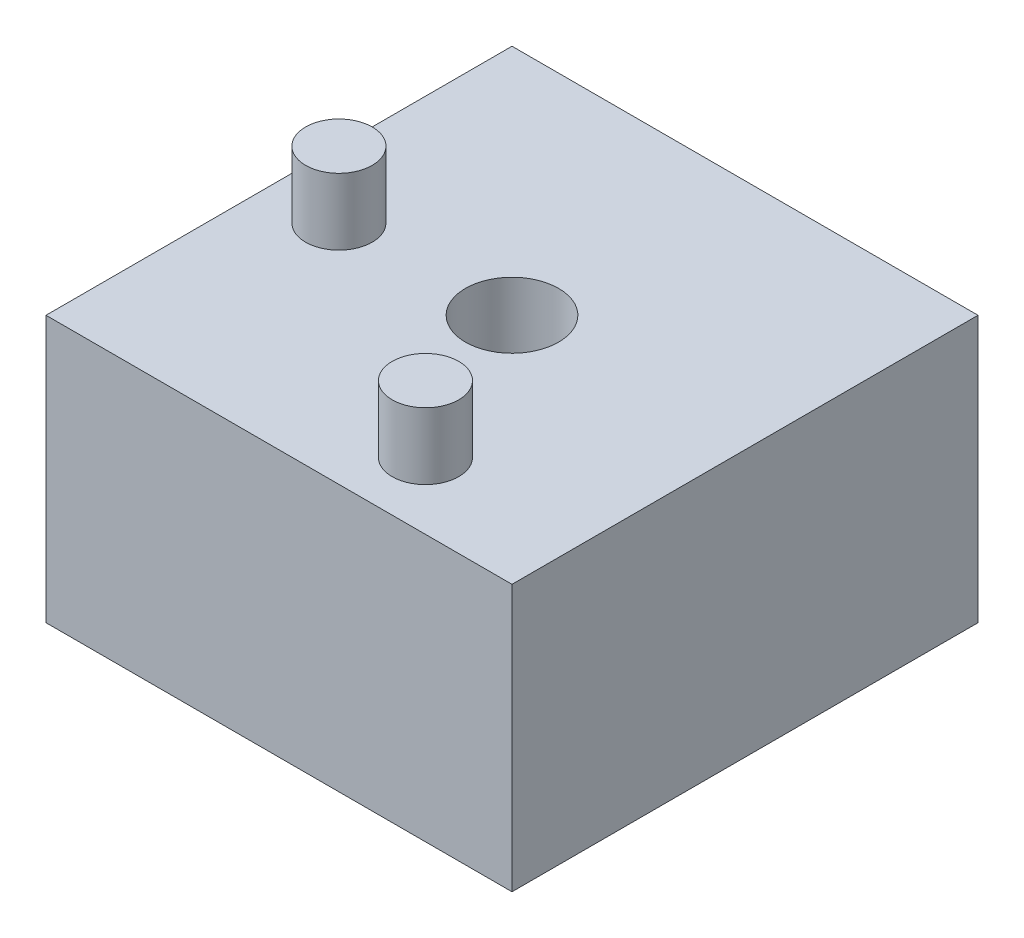
ISO-10303-21;
HEADER;
FILE_DESCRIPTION(('STEP AP214'),'2;1');
FILE_NAME('part.step','',(''),(''),'','','');
FILE_SCHEMA(('AUTOMOTIVE_DESIGN { 1 0 10303 214 1 1 1 1 }'));
ENDSEC;
DATA;
#1=APPLICATION_CONTEXT('core data for automotive mechanical design processes');
#2=APPLICATION_PROTOCOL_DEFINITION('international standard','automotive_design',2000,#1);
#3=PRODUCT_CONTEXT('',#1,'mechanical');
#4=PRODUCT('Part','Part','',(#3));
#5=PRODUCT_RELATED_PRODUCT_CATEGORY('part','',(#4));
#6=PRODUCT_DEFINITION_FORMATION('','',#4);
#7=PRODUCT_DEFINITION_CONTEXT('part definition',#1,'design');
#8=PRODUCT_DEFINITION('design','',#6,#7);
#9=PRODUCT_DEFINITION_SHAPE('','',#8);
#10=(LENGTH_UNIT() NAMED_UNIT(*) SI_UNIT(.MILLI.,.METRE.));
#11=(NAMED_UNIT(*) PLANE_ANGLE_UNIT() SI_UNIT($,.RADIAN.));
#12=(NAMED_UNIT(*) SI_UNIT($,.STERADIAN.) SOLID_ANGLE_UNIT());
#13=UNCERTAINTY_MEASURE_WITH_UNIT(LENGTH_MEASURE(1.E-05),#10,'distance_accuracy_value','');
#14=(GEOMETRIC_REPRESENTATION_CONTEXT(3) GLOBAL_UNCERTAINTY_ASSIGNED_CONTEXT((#13)) GLOBAL_UNIT_ASSIGNED_CONTEXT((#10,
#11,#12)) REPRESENTATION_CONTEXT('',''));
#15=CARTESIAN_POINT('',(0.,0.,0.));
#16=DIRECTION('',(0.,0.,1.));
#17=DIRECTION('',(1.,0.,0.));
#18=AXIS2_PLACEMENT_3D('',#15,#16,#17);
#19=CARTESIAN_POINT('',(0.,25.4,0.));
#20=DIRECTION('',(1.,0.,0.));
#21=DIRECTION('',(0.,0.,-1.));
#22=AXIS2_PLACEMENT_3D('',#19,#20,#21);
#23=PLANE('',#22);
#24=DIRECTION('',(0.,0.,1.));
#25=VECTOR('',#24,1.);
#26=CARTESIAN_POINT('',(0.,0.,0.));
#27=LINE('',#26,#25);
#28=CARTESIAN_POINT('',(0.,0.,-44.45));
#29=VERTEX_POINT('',#28);
#30=CARTESIAN_POINT('',(0.,0.,0.));
#31=VERTEX_POINT('',#30);
#32=EDGE_CURVE('E120',#29,#31,#27,.T.);
#33=ORIENTED_EDGE('',*,*,#32,.T.);
#34=DIRECTION('',(0.,-1.,0.));
#35=VECTOR('',#34,1.);
#36=CARTESIAN_POINT('',(0.,25.4,0.));
#37=LINE('',#36,#35);
#38=CARTESIAN_POINT('',(0.,25.4,0.));
#39=VERTEX_POINT('',#38);
#40=EDGE_CURVE('E48',#39,#31,#37,.T.);
#41=ORIENTED_EDGE('',*,*,#40,.F.);
#42=DIRECTION('',(0.,0.,1.));
#43=VECTOR('',#42,1.);
#44=CARTESIAN_POINT('',(0.,25.4,0.));
#45=LINE('',#44,#43);
#46=CARTESIAN_POINT('',(0.,25.4,-44.45));
#47=VERTEX_POINT('',#46);
#48=EDGE_CURVE('E99',#47,#39,#45,.T.);
#49=ORIENTED_EDGE('',*,*,#48,.F.);
#50=DIRECTION('',(0.,-1.,0.));
#51=VECTOR('',#50,1.);
#52=CARTESIAN_POINT('',(0.,25.4,-44.45));
#53=LINE('',#52,#51);
#54=EDGE_CURVE('E113',#47,#29,#53,.T.);
#55=ORIENTED_EDGE('',*,*,#54,.T.);
#56=EDGE_LOOP('',(#33,#41,#49,#55));
#57=FACE_BOUND('',#56,.T.);
#58=ADVANCED_FACE('F44',(#57),#23,.F.);
#59=CARTESIAN_POINT('',(0.,25.4,0.));
#60=DIRECTION('',(0.,0.,-1.));
#61=DIRECTION('',(-1.,0.,0.));
#62=AXIS2_PLACEMENT_3D('',#59,#60,#61);
#63=PLANE('',#62);
#64=DIRECTION('',(1.,0.,0.));
#65=VECTOR('',#64,1.);
#66=CARTESIAN_POINT('',(0.,0.,0.));
#67=LINE('',#66,#65);
#68=CARTESIAN_POINT('',(44.45,0.,0.));
#69=VERTEX_POINT('',#68);
#70=EDGE_CURVE('E106',#31,#69,#67,.T.);
#71=ORIENTED_EDGE('',*,*,#70,.T.);
#72=DIRECTION('',(0.,-1.,0.));
#73=VECTOR('',#72,1.);
#74=CARTESIAN_POINT('',(44.45,25.4,0.));
#75=LINE('',#74,#73);
#76=CARTESIAN_POINT('',(44.45,25.4,0.));
#77=VERTEX_POINT('',#76);
#78=EDGE_CURVE('E104',#77,#69,#75,.T.);
#79=ORIENTED_EDGE('',*,*,#78,.F.);
#80=DIRECTION('',(1.,0.,0.));
#81=VECTOR('',#80,1.);
#82=CARTESIAN_POINT('',(0.,25.4,0.));
#83=LINE('',#82,#81);
#84=EDGE_CURVE('E93',#39,#77,#83,.T.);
#85=ORIENTED_EDGE('',*,*,#84,.F.);
#86=ORIENTED_EDGE('',*,*,#40,.T.);
#87=EDGE_LOOP('',(#71,#79,#85,#86));
#88=FACE_BOUND('',#87,.T.);
#89=ADVANCED_FACE('F102',(#88),#63,.F.);
#90=CARTESIAN_POINT('',(44.45,25.4,0.));
#91=DIRECTION('',(-1.,0.,0.));
#92=DIRECTION('',(0.,0.,1.));
#93=AXIS2_PLACEMENT_3D('',#90,#91,#92);
#94=PLANE('',#93);
#95=DIRECTION('',(0.,0.,-1.));
#96=VECTOR('',#95,1.);
#97=CARTESIAN_POINT('',(44.45,0.,0.));
#98=LINE('',#97,#96);
#99=CARTESIAN_POINT('',(44.45,0.,-44.45));
#100=VERTEX_POINT('',#99);
#101=EDGE_CURVE('E82',#69,#100,#98,.T.);
#102=ORIENTED_EDGE('',*,*,#101,.T.);
#103=DIRECTION('',(0.,-1.,0.));
#104=VECTOR('',#103,1.);
#105=CARTESIAN_POINT('',(44.45,25.4,-44.45));
#106=LINE('',#105,#104);
#107=CARTESIAN_POINT('',(44.45,25.4,-44.45));
#108=VERTEX_POINT('',#107);
#109=EDGE_CURVE('E108',#108,#100,#106,.T.);
#110=ORIENTED_EDGE('',*,*,#109,.F.);
#111=DIRECTION('',(0.,0.,-1.));
#112=VECTOR('',#111,1.);
#113=CARTESIAN_POINT('',(44.45,25.4,0.));
#114=LINE('',#113,#112);
#115=EDGE_CURVE('E96',#77,#108,#114,.T.);
#116=ORIENTED_EDGE('',*,*,#115,.F.);
#117=ORIENTED_EDGE('',*,*,#78,.T.);
#118=EDGE_LOOP('',(#102,#110,#116,#117));
#119=FACE_BOUND('',#118,.T.);
#120=ADVANCED_FACE('F107',(#119),#94,.F.);
#121=CARTESIAN_POINT('',(0.,25.4,-44.45));
#122=DIRECTION('',(0.,0.,1.));
#123=DIRECTION('',(1.,0.,0.));
#124=AXIS2_PLACEMENT_3D('',#121,#122,#123);
#125=PLANE('',#124);
#126=DIRECTION('',(-1.,0.,0.));
#127=VECTOR('',#126,1.);
#128=CARTESIAN_POINT('',(0.,0.,-44.45));
#129=LINE('',#128,#127);
#130=EDGE_CURVE('E90',#100,#29,#129,.T.);
#131=ORIENTED_EDGE('',*,*,#130,.T.);
#132=ORIENTED_EDGE('',*,*,#54,.F.);
#133=DIRECTION('',(-1.,0.,0.));
#134=VECTOR('',#133,1.);
#135=CARTESIAN_POINT('',(0.,25.4,-44.45));
#136=LINE('',#135,#134);
#137=EDGE_CURVE('E61',#108,#47,#136,.T.);
#138=ORIENTED_EDGE('',*,*,#137,.F.);
#139=ORIENTED_EDGE('',*,*,#109,.T.);
#140=EDGE_LOOP('',(#131,#132,#138,#139));
#141=FACE_BOUND('',#140,.T.);
#142=ADVANCED_FACE('F131',(#141),#125,.F.);
#143=CARTESIAN_POINT('',(0.,25.4,0.));
#144=DIRECTION('',(0.,-1.,0.));
#145=DIRECTION('',(0.,0.,-1.));
#146=AXIS2_PLACEMENT_3D('',#143,#144,#145);
#147=PLANE('',#146);
#148=CARTESIAN_POINT('',(22.225,25.4,-22.225));
#149=DIRECTION('',(0.,-1.,0.));
#150=DIRECTION('',(0.,0.,-1.));
#151=AXIS2_PLACEMENT_3D('',#148,#149,#150);
#152=CIRCLE('',#151,4.445);
#153=CARTESIAN_POINT('',(22.225,25.4,-26.67));
#154=VERTEX_POINT('',#153);
#155=EDGE_CURVE('E145',#154,#154,#152,.T.);
#156=ORIENTED_EDGE('',*,*,#155,.T.);
#157=EDGE_LOOP('',(#156));
#158=FACE_BOUND('',#157,.T.);
#159=CARTESIAN_POINT('',(6.34999999999999,25.4,-21.59));
#160=DIRECTION('',(0.,1.,0.));
#161=DIRECTION('',(0.,0.,1.));
#162=AXIS2_PLACEMENT_3D('',#159,#160,#161);
#163=CIRCLE('',#162,3.175);
#164=CARTESIAN_POINT('',(6.34999999999999,25.4,-18.415));
#165=VERTEX_POINT('',#164);
#166=EDGE_CURVE('E11',#165,#165,#163,.T.);
#167=ORIENTED_EDGE('',*,*,#166,.F.);
#168=EDGE_LOOP('',(#167));
#169=FACE_BOUND('',#168,.T.);
#170=CARTESIAN_POINT('',(29.845,25.4,-6.35));
#171=DIRECTION('',(0.,1.,0.));
#172=DIRECTION('',(0.,0.,1.));
#173=AXIS2_PLACEMENT_3D('',#170,#171,#172);
#174=CIRCLE('',#173,3.175);
#175=CARTESIAN_POINT('',(29.845,25.4,-3.175));
#176=VERTEX_POINT('',#175);
#177=EDGE_CURVE('E54',#176,#176,#174,.T.);
#178=ORIENTED_EDGE('',*,*,#177,.F.);
#179=EDGE_LOOP('',(#178));
#180=FACE_BOUND('',#179,.T.);
#181=ORIENTED_EDGE('',*,*,#48,.T.);
#182=ORIENTED_EDGE('',*,*,#84,.T.);
#183=ORIENTED_EDGE('',*,*,#115,.T.);
#184=ORIENTED_EDGE('',*,*,#137,.T.);
#185=EDGE_LOOP('',(#181,#182,#183,#184));
#186=FACE_BOUND('',#185,.T.);
#187=ADVANCED_FACE('F98',(#158,#169,#180,#186),#147,.F.);
#188=CARTESIAN_POINT('',(0.,0.,0.));
#189=DIRECTION('',(0.,-1.,0.));
#190=DIRECTION('',(0.,0.,-1.));
#191=AXIS2_PLACEMENT_3D('',#188,#189,#190);
#192=PLANE('',#191);
#193=CARTESIAN_POINT('',(22.225,0.,-22.225));
#194=DIRECTION('',(0.,-1.,0.));
#195=DIRECTION('',(0.,0.,-1.));
#196=AXIS2_PLACEMENT_3D('',#193,#194,#195);
#197=CIRCLE('',#196,4.445);
#198=CARTESIAN_POINT('',(22.225,0.,-26.67));
#199=VERTEX_POINT('',#198);
#200=EDGE_CURVE('E146',#199,#199,#197,.T.);
#201=ORIENTED_EDGE('',*,*,#200,.F.);
#202=EDGE_LOOP('',(#201));
#203=FACE_BOUND('',#202,.T.);
#204=ORIENTED_EDGE('',*,*,#32,.F.);
#205=ORIENTED_EDGE('',*,*,#130,.F.);
#206=ORIENTED_EDGE('',*,*,#101,.F.);
#207=ORIENTED_EDGE('',*,*,#70,.F.);
#208=EDGE_LOOP('',(#204,#205,#206,#207));
#209=FACE_BOUND('',#208,.T.);
#210=ADVANCED_FACE('F132',(#203,#209),#192,.T.);
#211=CARTESIAN_POINT('',(29.845,31.75,-6.35));
#212=DIRECTION('',(0.,-1.,0.));
#213=DIRECTION('',(0.,0.,-1.));
#214=AXIS2_PLACEMENT_3D('',#211,#212,#213);
#215=CYLINDRICAL_SURFACE('',#214,3.175);
#216=CARTESIAN_POINT('',(29.845,31.75,-6.35));
#217=DIRECTION('',(0.,1.,0.));
#218=DIRECTION('',(0.,0.,1.));
#219=AXIS2_PLACEMENT_3D('',#216,#217,#218);
#220=CIRCLE('',#219,3.175);
#221=CARTESIAN_POINT('',(29.845,31.75,-3.175));
#222=VERTEX_POINT('',#221);
#223=EDGE_CURVE('E139',#222,#222,#220,.T.);
#224=ORIENTED_EDGE('',*,*,#223,.F.);
#225=EDGE_LOOP('',(#224));
#226=FACE_BOUND('',#225,.T.);
#227=ORIENTED_EDGE('',*,*,#177,.T.);
#228=EDGE_LOOP('',(#227));
#229=FACE_BOUND('',#228,.T.);
#230=ADVANCED_FACE('F170',(#226,#229),#215,.T.);
#231=CARTESIAN_POINT('',(29.845,31.75,-6.35));
#232=DIRECTION('',(0.,1.,0.));
#233=DIRECTION('',(0.,0.,1.));
#234=AXIS2_PLACEMENT_3D('',#231,#232,#233);
#235=PLANE('',#234);
#236=ORIENTED_EDGE('',*,*,#223,.T.);
#237=EDGE_LOOP('',(#236));
#238=FACE_BOUND('',#237,.T.);
#239=ADVANCED_FACE('F173',(#238),#235,.T.);
#240=CARTESIAN_POINT('',(6.34999999999999,31.75,-21.59));
#241=DIRECTION('',(0.,-1.,0.));
#242=DIRECTION('',(0.,0.,-1.));
#243=AXIS2_PLACEMENT_3D('',#240,#241,#242);
#244=CYLINDRICAL_SURFACE('',#243,3.175);
#245=CARTESIAN_POINT('',(6.34999999999999,31.75,-21.59));
#246=DIRECTION('',(0.,1.,0.));
#247=DIRECTION('',(0.,0.,1.));
#248=AXIS2_PLACEMENT_3D('',#245,#246,#247);
#249=CIRCLE('',#248,3.175);
#250=CARTESIAN_POINT('',(6.34999999999999,31.75,-18.415));
#251=VERTEX_POINT('',#250);
#252=EDGE_CURVE('E122',#251,#251,#249,.T.);
#253=ORIENTED_EDGE('',*,*,#252,.F.);
#254=EDGE_LOOP('',(#253));
#255=FACE_BOUND('',#254,.T.);
#256=ORIENTED_EDGE('',*,*,#166,.T.);
#257=EDGE_LOOP('',(#256));
#258=FACE_BOUND('',#257,.T.);
#259=ADVANCED_FACE('F201',(#255,#258),#244,.T.);
#260=CARTESIAN_POINT('',(6.34999999999999,31.75,-21.59));
#261=DIRECTION('',(0.,1.,0.));
#262=DIRECTION('',(0.,0.,1.));
#263=AXIS2_PLACEMENT_3D('',#260,#261,#262);
#264=PLANE('',#263);
#265=ORIENTED_EDGE('',*,*,#252,.T.);
#266=EDGE_LOOP('',(#265));
#267=FACE_BOUND('',#266,.T.);
#268=ADVANCED_FACE('F162',(#267),#264,.T.);
#269=CARTESIAN_POINT('',(22.225,25.4,-22.225));
#270=DIRECTION('',(0.,-1.,0.));
#271=DIRECTION('',(0.,0.,-1.));
#272=AXIS2_PLACEMENT_3D('',#269,#270,#271);
#273=CYLINDRICAL_SURFACE('',#272,4.445);
#274=ORIENTED_EDGE('',*,*,#155,.F.);
#275=EDGE_LOOP('',(#274));
#276=FACE_BOUND('',#275,.T.);
#277=ORIENTED_EDGE('',*,*,#200,.T.);
#278=EDGE_LOOP('',(#277));
#279=FACE_BOUND('',#278,.T.);
#280=ADVANCED_FACE('F156',(#276,#279),#273,.F.);
#281=CLOSED_SHELL('',(#58,#89,#120,#142,#187,#210,#230,#239,#259,#268,#280));
#282=MANIFOLD_SOLID_BREP('B2',#281);
#283=ADVANCED_BREP_SHAPE_REPRESENTATION('',(#18,#282),#14);
#284=SHAPE_DEFINITION_REPRESENTATION(#9,#283);
ENDSEC;
END-ISO-10303-21;
